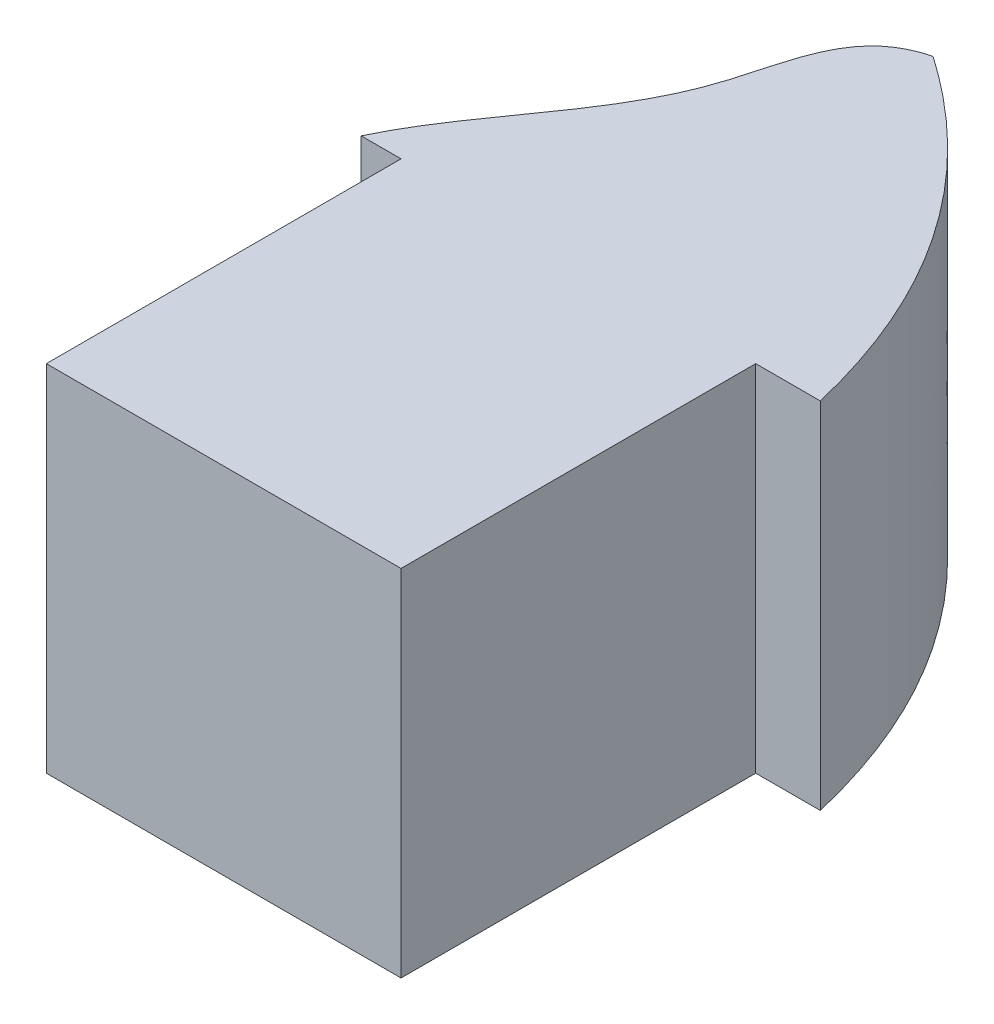
ISO-10303-21;
HEADER;
FILE_DESCRIPTION(('STEP AP214'),'2;1');
FILE_NAME('part.step','',(''),(''),'','','');
FILE_SCHEMA(('AUTOMOTIVE_DESIGN { 1 0 10303 214 1 1 1 1 }'));
ENDSEC;
DATA;
#1=APPLICATION_CONTEXT('core data for automotive mechanical design processes');
#2=APPLICATION_PROTOCOL_DEFINITION('international standard','automotive_design',2000,#1);
#3=PRODUCT_CONTEXT('',#1,'mechanical');
#4=PRODUCT('Part','Part','',(#3));
#5=PRODUCT_RELATED_PRODUCT_CATEGORY('part','',(#4));
#6=PRODUCT_DEFINITION_FORMATION('','',#4);
#7=PRODUCT_DEFINITION_CONTEXT('part definition',#1,'design');
#8=PRODUCT_DEFINITION('design','',#6,#7);
#9=PRODUCT_DEFINITION_SHAPE('','',#8);
#10=(LENGTH_UNIT() NAMED_UNIT(*) SI_UNIT(.MILLI.,.METRE.));
#11=(NAMED_UNIT(*) PLANE_ANGLE_UNIT() SI_UNIT($,.RADIAN.));
#12=(NAMED_UNIT(*) SI_UNIT($,.STERADIAN.) SOLID_ANGLE_UNIT());
#13=UNCERTAINTY_MEASURE_WITH_UNIT(LENGTH_MEASURE(1.E-05),#10,'distance_accuracy_value','');
#14=(GEOMETRIC_REPRESENTATION_CONTEXT(3) GLOBAL_UNCERTAINTY_ASSIGNED_CONTEXT((#13)) GLOBAL_UNIT_ASSIGNED_CONTEXT((#10,
#11,#12)) REPRESENTATION_CONTEXT('',''));
#15=CARTESIAN_POINT('',(0.,0.,0.));
#16=DIRECTION('',(0.,0.,1.));
#17=DIRECTION('',(1.,0.,0.));
#18=AXIS2_PLACEMENT_3D('',#15,#16,#17);
#19=CARTESIAN_POINT('',(32.7421202287171,8.62861972145268,-6.35));
#20=DIRECTION('',(0.,-1.,0.));
#21=DIRECTION('',(0.,0.,-1.));
#22=AXIS2_PLACEMENT_3D('',#19,#20,#21);
#23=PLANE('',#22);
#24=CARTESIAN_POINT('',(32.3854316338867,8.62861972145268,-3.17499999999998));
#25=CARTESIAN_POINT('',(32.7188012046779,8.62861972145268,-3.87839246139033));
#26=CARTESIAN_POINT('',(33.6903380875493,8.62861972145268,-4.75941275473756));
#27=CARTESIAN_POINT('',(33.7565645448273,8.62861972145268,-6.21114396246148));
#28=CARTESIAN_POINT('',(34.3296202287171,8.62861972145268,-6.34999999999998));
#29=B_SPLINE_CURVE_WITH_KNOTS('',3,(#24,#25,#26,#27,#28),.UNSPECIFIED.,.F.,.F.,(4,1,4),(0.,
0.611532207592703,1.),.UNSPECIFIED.);
#30=CARTESIAN_POINT('',(32.3854316338867,8.62861972145268,-3.17499999999998));
#31=VERTEX_POINT('',#30);
#32=CARTESIAN_POINT('',(34.3296202287171,8.62861972145268,-6.34999999999999));
#33=VERTEX_POINT('',#32);
#34=EDGE_CURVE('E92',#31,#33,#29,.T.);
#35=ORIENTED_EDGE('',*,*,#34,.F.);
#36=DIRECTION('',(-1.,0.,0.));
#37=VECTOR('',#36,1.);
#38=CARTESIAN_POINT('',(31.1546202287171,8.62861972145268,-3.17499999999998));
#39=LINE('',#38,#37);
#40=CARTESIAN_POINT('',(32.7421202287171,8.62861972145268,-3.17499999999998));
#41=VERTEX_POINT('',#40);
#42=EDGE_CURVE('E216',#41,#31,#39,.T.);
#43=ORIENTED_EDGE('',*,*,#42,.F.);
#44=DIRECTION('',(0.,0.,1.));
#45=VECTOR('',#44,1.);
#46=CARTESIAN_POINT('',(32.7421202287171,8.62861972145268,-6.35));
#47=LINE('',#46,#45);
#48=CARTESIAN_POINT('',(32.7421202287171,8.62861972145268,0.));
#49=VERTEX_POINT('',#48);
#50=EDGE_CURVE('E232',#41,#49,#47,.T.);
#51=ORIENTED_EDGE('',*,*,#50,.T.);
#52=DIRECTION('',(1.,0.,0.));
#53=VECTOR('',#52,1.);
#54=CARTESIAN_POINT('',(32.7421202287171,8.62861972145268,0.));
#55=LINE('',#54,#53);
#56=CARTESIAN_POINT('',(35.9171202287171,8.62861972145268,0.));
#57=VERTEX_POINT('',#56);
#58=EDGE_CURVE('E220',#49,#57,#55,.T.);
#59=ORIENTED_EDGE('',*,*,#58,.T.);
#60=DIRECTION('',(0.,0.,1.));
#61=VECTOR('',#60,1.);
#62=CARTESIAN_POINT('',(35.9171202287171,8.62861972145268,-6.35));
#63=LINE('',#62,#61);
#64=CARTESIAN_POINT('',(35.9171202287171,8.62861972145268,-3.17499999999998));
#65=VERTEX_POINT('',#64);
#66=EDGE_CURVE('E40',#65,#57,#63,.T.);
#67=ORIENTED_EDGE('',*,*,#66,.F.);
#68=CARTESIAN_POINT('',(36.4952667265733,8.62861972145268,-3.17499999999998));
#69=VERTEX_POINT('',#68);
#70=EDGE_CURVE('E109',#69,#65,#39,.T.);
#71=ORIENTED_EDGE('',*,*,#70,.F.);
#72=CARTESIAN_POINT('',(36.4952667265733,8.62861972145268,-3.17499999999983));
#73=CARTESIAN_POINT('',(36.0210223127161,8.62861972145268,-5.17477302754863));
#74=CARTESIAN_POINT('',(34.3296202287171,8.62861972145268,-6.34999999999998));
#75=B_SPLINE_CURVE_WITH_KNOTS('',2,(#72,#73,#74),.UNSPECIFIED.,.F.,.F.,(3,3),(0.,1.),.UNSPECIFIED.);
#76=EDGE_CURVE('E47',#69,#33,#75,.T.);
#77=ORIENTED_EDGE('',*,*,#76,.T.);
#78=EDGE_LOOP('',(#35,#43,#51,#59,#67,#71,#77));
#79=FACE_BOUND('',#78,.T.);
#80=ADVANCED_FACE('F33',(#79),#23,.F.);
#81=CARTESIAN_POINT('',(32.7421202287171,5.45361972145268,-6.35));
#82=DIRECTION('',(0.,-1.,0.));
#83=DIRECTION('',(0.,0.,-1.));
#84=AXIS2_PLACEMENT_3D('',#81,#82,#83);
#85=PLANE('',#84);
#86=DIRECTION('',(-1.,0.,0.));
#87=VECTOR('',#86,1.);
#88=CARTESIAN_POINT('',(31.1546202287171,5.45361972145268,-3.17499999999998));
#89=LINE('',#88,#87);
#90=CARTESIAN_POINT('',(32.7421202287171,5.45361972145268,-3.17499999999998));
#91=VERTEX_POINT('',#90);
#92=CARTESIAN_POINT('',(32.3854316338867,5.45361972145268,-3.17499999999998));
#93=VERTEX_POINT('',#92);
#94=EDGE_CURVE('E218',#91,#93,#89,.T.);
#95=ORIENTED_EDGE('',*,*,#94,.T.);
#96=CARTESIAN_POINT('',(32.3854316338867,5.45361972145268,-3.17499999999998));
#97=CARTESIAN_POINT('',(32.7188012046779,5.45361972145268,-3.87839246139033));
#98=CARTESIAN_POINT('',(33.6903380875493,5.45361972145268,-4.75941275473756));
#99=CARTESIAN_POINT('',(33.7565645448273,5.45361972145268,-6.21114396246148));
#100=CARTESIAN_POINT('',(34.3296202287171,5.45361972145268,-6.34999999999998));
#101=B_SPLINE_CURVE_WITH_KNOTS('',3,(#96,#97,#98,#99,#100),.UNSPECIFIED.,.F.,.F.,(4,1,4),(0.,
0.611532207592703,1.),.UNSPECIFIED.);
#102=CARTESIAN_POINT('',(34.3296202287171,5.45361972145268,-6.34999999999999));
#103=VERTEX_POINT('',#102);
#104=EDGE_CURVE('E110',#93,#103,#101,.T.);
#105=ORIENTED_EDGE('',*,*,#104,.T.);
#106=CARTESIAN_POINT('',(36.4952667265733,5.45361972145268,-3.17499999999983));
#107=CARTESIAN_POINT('',(36.0210223127161,5.45361972145268,-5.17477302754863));
#108=CARTESIAN_POINT('',(34.3296202287171,5.45361972145268,-6.34999999999998));
#109=B_SPLINE_CURVE_WITH_KNOTS('',2,(#106,#107,#108),.UNSPECIFIED.,.F.,.F.,(3,3),(0.,1.),.UNSPECIFIED.);
#110=CARTESIAN_POINT('',(36.4952667265733,5.45361972145268,-3.17499999999983));
#111=VERTEX_POINT('',#110);
#112=EDGE_CURVE('E104',#111,#103,#109,.T.);
#113=ORIENTED_EDGE('',*,*,#112,.F.);
#114=CARTESIAN_POINT('',(35.9171202287171,5.45361972145268,-3.17499999999998));
#115=VERTEX_POINT('',#114);
#116=EDGE_CURVE('E55',#111,#115,#89,.T.);
#117=ORIENTED_EDGE('',*,*,#116,.T.);
#118=DIRECTION('',(0.,0.,1.));
#119=VECTOR('',#118,1.);
#120=CARTESIAN_POINT('',(35.9171202287171,5.45361972145268,-6.35));
#121=LINE('',#120,#119);
#122=CARTESIAN_POINT('',(35.9171202287171,5.45361972145268,0.));
#123=VERTEX_POINT('',#122);
#124=EDGE_CURVE('E236',#115,#123,#121,.T.);
#125=ORIENTED_EDGE('',*,*,#124,.T.);
#126=DIRECTION('',(1.,0.,0.));
#127=VECTOR('',#126,1.);
#128=CARTESIAN_POINT('',(32.7421202287171,5.45361972145268,0.));
#129=LINE('',#128,#127);
#130=CARTESIAN_POINT('',(32.7421202287171,5.45361972145268,0.));
#131=VERTEX_POINT('',#130);
#132=EDGE_CURVE('E226',#131,#123,#129,.T.);
#133=ORIENTED_EDGE('',*,*,#132,.F.);
#134=DIRECTION('',(0.,0.,1.));
#135=VECTOR('',#134,1.);
#136=CARTESIAN_POINT('',(32.7421202287171,5.45361972145268,-6.35));
#137=LINE('',#136,#135);
#138=EDGE_CURVE('E234',#91,#131,#137,.T.);
#139=ORIENTED_EDGE('',*,*,#138,.F.);
#140=EDGE_LOOP('',(#95,#105,#113,#117,#125,#133,#139));
#141=FACE_BOUND('',#140,.T.);
#142=ADVANCED_FACE('F131',(#141),#85,.T.);
#143=CARTESIAN_POINT('',(31.1546202287171,8.62861972145268,-3.17499999999998));
#144=DIRECTION('',(0.,0.,1.));
#145=DIRECTION('',(1.,0.,0.));
#146=AXIS2_PLACEMENT_3D('',#143,#144,#145);
#147=PLANE('',#146);
#148=ORIENTED_EDGE('',*,*,#42,.T.);
#149=DIRECTION('',(0.,-1.,0.));
#150=VECTOR('',#149,1.);
#151=CARTESIAN_POINT('',(32.3854316338867,8.62861972145268,-3.17499999999998));
#152=LINE('',#151,#150);
#153=EDGE_CURVE('E97',#31,#93,#152,.T.);
#154=ORIENTED_EDGE('',*,*,#153,.T.);
#155=ORIENTED_EDGE('',*,*,#94,.F.);
#156=DIRECTION('',(0.,1.,0.));
#157=VECTOR('',#156,1.);
#158=CARTESIAN_POINT('',(32.7421202287171,8.62861972145268,-3.17499999999998));
#159=LINE('',#158,#157);
#160=EDGE_CURVE('E11',#91,#41,#159,.T.);
#161=ORIENTED_EDGE('',*,*,#160,.T.);
#162=EDGE_LOOP('',(#148,#154,#155,#161));
#163=FACE_BOUND('',#162,.T.);
#164=ADVANCED_FACE('F127',(#163),#147,.T.);
#165=CARTESIAN_POINT('',(35.9171202287171,8.62861972145268,-6.35));
#166=DIRECTION('',(-1.,0.,0.));
#167=DIRECTION('',(0.,0.,1.));
#168=AXIS2_PLACEMENT_3D('',#165,#166,#167);
#169=PLANE('',#168);
#170=ORIENTED_EDGE('',*,*,#124,.F.);
#171=DIRECTION('',(0.,1.,0.));
#172=VECTOR('',#171,1.);
#173=CARTESIAN_POINT('',(35.9171202287171,8.62861972145268,-3.17499999999998));
#174=LINE('',#173,#172);
#175=EDGE_CURVE('E215',#115,#65,#174,.T.);
#176=ORIENTED_EDGE('',*,*,#175,.T.);
#177=ORIENTED_EDGE('',*,*,#66,.T.);
#178=DIRECTION('',(0.,-1.,0.));
#179=VECTOR('',#178,1.);
#180=CARTESIAN_POINT('',(35.9171202287171,8.62861972145268,0.));
#181=LINE('',#180,#179);
#182=EDGE_CURVE('E223',#57,#123,#181,.T.);
#183=ORIENTED_EDGE('',*,*,#182,.T.);
#184=EDGE_LOOP('',(#170,#176,#177,#183));
#185=FACE_BOUND('',#184,.T.);
#186=ADVANCED_FACE('F130',(#185),#169,.F.);
#187=CARTESIAN_POINT('',(32.7421202287171,8.62861972145268,-6.35));
#188=DIRECTION('',(-1.,0.,0.));
#189=DIRECTION('',(0.,0.,1.));
#190=AXIS2_PLACEMENT_3D('',#187,#188,#189);
#191=PLANE('',#190);
#192=ORIENTED_EDGE('',*,*,#160,.F.);
#193=ORIENTED_EDGE('',*,*,#138,.T.);
#194=DIRECTION('',(0.,-1.,0.));
#195=VECTOR('',#194,1.);
#196=CARTESIAN_POINT('',(32.7421202287171,8.62861972145268,0.));
#197=LINE('',#196,#195);
#198=EDGE_CURVE('E229',#49,#131,#197,.T.);
#199=ORIENTED_EDGE('',*,*,#198,.F.);
#200=ORIENTED_EDGE('',*,*,#50,.F.);
#201=EDGE_LOOP('',(#192,#193,#199,#200));
#202=FACE_BOUND('',#201,.T.);
#203=ADVANCED_FACE('F137',(#202),#191,.T.);
#204=CARTESIAN_POINT('',(0.,0.,0.));
#205=DIRECTION('',(0.,0.,-1.));
#206=DIRECTION('',(-1.,0.,0.));
#207=AXIS2_PLACEMENT_3D('',#204,#205,#206);
#208=PLANE('',#207);
#209=ORIENTED_EDGE('',*,*,#58,.F.);
#210=ORIENTED_EDGE('',*,*,#198,.T.);
#211=ORIENTED_EDGE('',*,*,#132,.T.);
#212=ORIENTED_EDGE('',*,*,#182,.F.);
#213=EDGE_LOOP('',(#209,#210,#211,#212));
#214=FACE_BOUND('',#213,.T.);
#215=ADVANCED_FACE('F134',(#214),#208,.F.);
#216=DIRECTION('',(0.,-1.,0.));
#217=VECTOR('',#216,1.);
#218=CARTESIAN_POINT('',(36.4952667265733,8.62861972145268,-3.17499999999983));
#219=LINE('',#218,#217);
#220=EDGE_CURVE('E101',#69,#111,#219,.T.);
#221=ORIENTED_EDGE('',*,*,#220,.F.);
#222=ORIENTED_EDGE('',*,*,#70,.T.);
#223=ORIENTED_EDGE('',*,*,#175,.F.);
#224=ORIENTED_EDGE('',*,*,#116,.F.);
#225=EDGE_LOOP('',(#221,#222,#223,#224));
#226=FACE_BOUND('',#225,.T.);
#227=ADVANCED_FACE('F133',(#226),#147,.T.);
#228=DIRECTION('',(0.,-1.,0.));
#229=VECTOR('',#228,1.);
#230=SURFACE_OF_LINEAR_EXTRUSION('',#29,#229);
#231=ORIENTED_EDGE('',*,*,#104,.F.);
#232=ORIENTED_EDGE('',*,*,#153,.F.);
#233=ORIENTED_EDGE('',*,*,#34,.T.);
#234=DIRECTION('',(0.,-1.,0.));
#235=VECTOR('',#234,1.);
#236=CARTESIAN_POINT('',(34.3296202287171,8.62861972145268,-6.34999999999999));
#237=LINE('',#236,#235);
#238=EDGE_CURVE('E94',#33,#103,#237,.T.);
#239=ORIENTED_EDGE('',*,*,#238,.T.);
#240=EDGE_LOOP('',(#231,#232,#233,#239));
#241=FACE_BOUND('',#240,.T.);
#242=ADVANCED_FACE('F93',(#241),#230,.T.);
#243=DIRECTION('',(0.,-1.,0.));
#244=VECTOR('',#243,1.);
#245=SURFACE_OF_LINEAR_EXTRUSION('',#75,#244);
#246=ORIENTED_EDGE('',*,*,#112,.T.);
#247=ORIENTED_EDGE('',*,*,#238,.F.);
#248=ORIENTED_EDGE('',*,*,#76,.F.);
#249=ORIENTED_EDGE('',*,*,#220,.T.);
#250=EDGE_LOOP('',(#246,#247,#248,#249));
#251=FACE_BOUND('',#250,.T.);
#252=ADVANCED_FACE('F103',(#251),#245,.F.);
#253=CLOSED_SHELL('',(#80,#142,#164,#186,#203,#215,#227,#242,#252));
#254=MANIFOLD_SOLID_BREP('B2',#253);
#255=ADVANCED_BREP_SHAPE_REPRESENTATION('',(#18,#254),#14);
#256=SHAPE_DEFINITION_REPRESENTATION(#9,#255);
ENDSEC;
END-ISO-10303-21;
